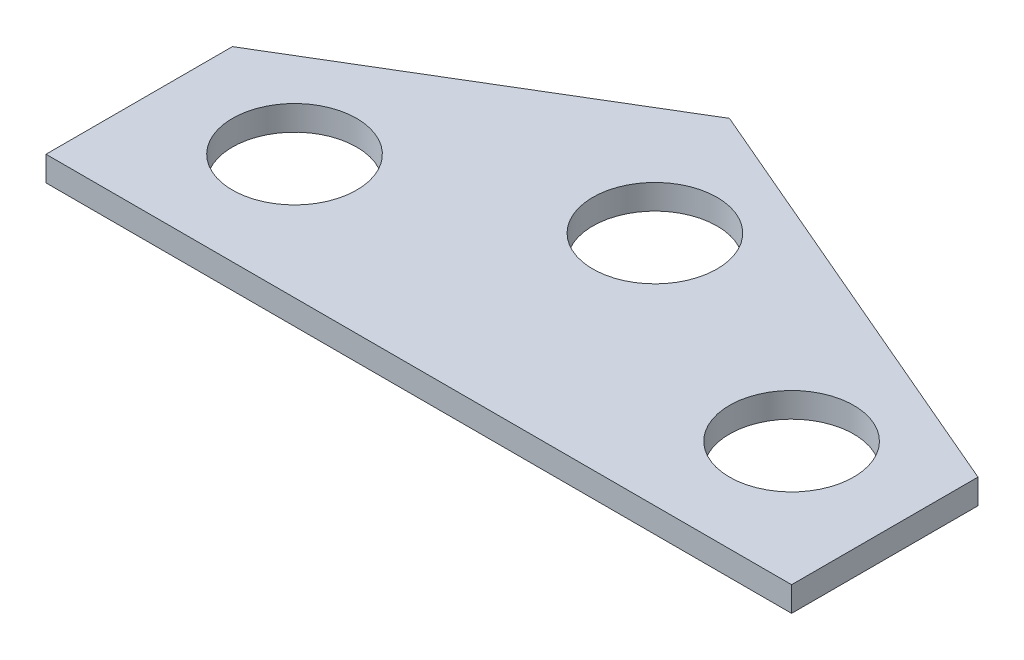
ISO-10303-21;
HEADER;
FILE_DESCRIPTION(('STEP AP214'),'2;1');
FILE_NAME('part.step','',(''),(''),'','','');
FILE_SCHEMA(('AUTOMOTIVE_DESIGN { 1 0 10303 214 1 1 1 1 }'));
ENDSEC;
DATA;
#1=APPLICATION_CONTEXT('core data for automotive mechanical design processes');
#2=APPLICATION_PROTOCOL_DEFINITION('international standard','automotive_design',2000,#1);
#3=PRODUCT_CONTEXT('',#1,'mechanical');
#4=PRODUCT('Part','Part','',(#3));
#5=PRODUCT_RELATED_PRODUCT_CATEGORY('part','',(#4));
#6=PRODUCT_DEFINITION_FORMATION('','',#4);
#7=PRODUCT_DEFINITION_CONTEXT('part definition',#1,'design');
#8=PRODUCT_DEFINITION('design','',#6,#7);
#9=PRODUCT_DEFINITION_SHAPE('','',#8);
#10=(LENGTH_UNIT() NAMED_UNIT(*) SI_UNIT(.MILLI.,.METRE.));
#11=(NAMED_UNIT(*) PLANE_ANGLE_UNIT() SI_UNIT($,.RADIAN.));
#12=(NAMED_UNIT(*) SI_UNIT($,.STERADIAN.) SOLID_ANGLE_UNIT());
#13=UNCERTAINTY_MEASURE_WITH_UNIT(LENGTH_MEASURE(1.E-05),#10,'distance_accuracy_value','');
#14=(GEOMETRIC_REPRESENTATION_CONTEXT(3) GLOBAL_UNCERTAINTY_ASSIGNED_CONTEXT((#13)) GLOBAL_UNIT_ASSIGNED_CONTEXT((#10,
#11,#12)) REPRESENTATION_CONTEXT('',''));
#15=CARTESIAN_POINT('',(0.,0.,0.));
#16=DIRECTION('',(0.,0.,1.));
#17=DIRECTION('',(1.,0.,0.));
#18=AXIS2_PLACEMENT_3D('',#15,#16,#17);
#19=CARTESIAN_POINT('',(0.,2.,0.));
#20=DIRECTION('',(1.,0.,0.));
#21=DIRECTION('',(0.,0.,-1.));
#22=AXIS2_PLACEMENT_3D('',#19,#20,#21);
#23=PLANE('',#22);
#24=DIRECTION('',(0.,0.,1.));
#25=VECTOR('',#24,1.);
#26=CARTESIAN_POINT('',(0.,2.,0.));
#27=LINE('',#26,#25);
#28=CARTESIAN_POINT('',(0.,2.,-15.));
#29=VERTEX_POINT('',#28);
#30=CARTESIAN_POINT('',(0.,2.,0.));
#31=VERTEX_POINT('',#30);
#32=EDGE_CURVE('E115',#29,#31,#27,.T.);
#33=ORIENTED_EDGE('',*,*,#32,.F.);
#34=DIRECTION('',(0.,1.,0.));
#35=VECTOR('',#34,1.);
#36=CARTESIAN_POINT('',(0.,0.,-15.));
#37=LINE('',#36,#35);
#38=CARTESIAN_POINT('',(0.,0.,-15.));
#39=VERTEX_POINT('',#38);
#40=EDGE_CURVE('E127',#39,#29,#37,.T.);
#41=ORIENTED_EDGE('',*,*,#40,.F.);
#42=DIRECTION('',(0.,0.,1.));
#43=VECTOR('',#42,1.);
#44=CARTESIAN_POINT('',(0.,0.,0.));
#45=LINE('',#44,#43);
#46=CARTESIAN_POINT('',(0.,0.,0.));
#47=VERTEX_POINT('',#46);
#48=EDGE_CURVE('E103',#39,#47,#45,.T.);
#49=ORIENTED_EDGE('',*,*,#48,.T.);
#50=DIRECTION('',(0.,-1.,0.));
#51=VECTOR('',#50,1.);
#52=CARTESIAN_POINT('',(0.,2.,0.));
#53=LINE('',#52,#51);
#54=EDGE_CURVE('E12',#31,#47,#53,.T.);
#55=ORIENTED_EDGE('',*,*,#54,.F.);
#56=EDGE_LOOP('',(#33,#41,#49,#55));
#57=FACE_BOUND('',#56,.T.);
#58=ADVANCED_FACE('F57',(#57),#23,.F.);
#59=CARTESIAN_POINT('',(0.,2.,0.));
#60=DIRECTION('',(0.,0.,-1.));
#61=DIRECTION('',(-1.,0.,0.));
#62=AXIS2_PLACEMENT_3D('',#59,#60,#61);
#63=PLANE('',#62);
#64=DIRECTION('',(1.,0.,0.));
#65=VECTOR('',#64,1.);
#66=CARTESIAN_POINT('',(0.,0.,0.));
#67=LINE('',#66,#65);
#68=CARTESIAN_POINT('',(60.,0.,0.));
#69=VERTEX_POINT('',#68);
#70=EDGE_CURVE('E93',#47,#69,#67,.T.);
#71=ORIENTED_EDGE('',*,*,#70,.T.);
#72=DIRECTION('',(0.,-1.,0.));
#73=VECTOR('',#72,1.);
#74=CARTESIAN_POINT('',(60.,2.,0.));
#75=LINE('',#74,#73);
#76=CARTESIAN_POINT('',(60.,2.,0.));
#77=VERTEX_POINT('',#76);
#78=EDGE_CURVE('E65',#77,#69,#75,.T.);
#79=ORIENTED_EDGE('',*,*,#78,.F.);
#80=DIRECTION('',(1.,0.,0.));
#81=VECTOR('',#80,1.);
#82=CARTESIAN_POINT('',(0.,2.,0.));
#83=LINE('',#82,#81);
#84=EDGE_CURVE('E81',#31,#77,#83,.T.);
#85=ORIENTED_EDGE('',*,*,#84,.F.);
#86=ORIENTED_EDGE('',*,*,#54,.T.);
#87=EDGE_LOOP('',(#71,#79,#85,#86));
#88=FACE_BOUND('',#87,.T.);
#89=ADVANCED_FACE('F95',(#88),#63,.F.);
#90=CARTESIAN_POINT('',(60.,2.,0.));
#91=DIRECTION('',(-1.,0.,0.));
#92=DIRECTION('',(0.,0.,1.));
#93=AXIS2_PLACEMENT_3D('',#90,#91,#92);
#94=PLANE('',#93);
#95=DIRECTION('',(0.,0.,-1.));
#96=VECTOR('',#95,1.);
#97=CARTESIAN_POINT('',(60.,0.,0.));
#98=LINE('',#97,#96);
#99=CARTESIAN_POINT('',(60.,0.,-15.));
#100=VERTEX_POINT('',#99);
#101=EDGE_CURVE('E102',#69,#100,#98,.T.);
#102=ORIENTED_EDGE('',*,*,#101,.T.);
#103=DIRECTION('',(0.,1.,0.));
#104=VECTOR('',#103,1.);
#105=CARTESIAN_POINT('',(60.,0.,-15.));
#106=LINE('',#105,#104);
#107=CARTESIAN_POINT('',(60.,2.,-15.));
#108=VERTEX_POINT('',#107);
#109=EDGE_CURVE('E138',#100,#108,#106,.T.);
#110=ORIENTED_EDGE('',*,*,#109,.T.);
#111=DIRECTION('',(0.,0.,-1.));
#112=VECTOR('',#111,1.);
#113=CARTESIAN_POINT('',(60.,2.,0.));
#114=LINE('',#113,#112);
#115=EDGE_CURVE('E110',#77,#108,#114,.T.);
#116=ORIENTED_EDGE('',*,*,#115,.F.);
#117=ORIENTED_EDGE('',*,*,#78,.T.);
#118=EDGE_LOOP('',(#102,#110,#116,#117));
#119=FACE_BOUND('',#118,.T.);
#120=ADVANCED_FACE('F107',(#119),#94,.F.);
#121=CARTESIAN_POINT('',(0.,2.,0.));
#122=DIRECTION('',(0.,-1.,0.));
#123=DIRECTION('',(0.,0.,-1.));
#124=AXIS2_PLACEMENT_3D('',#121,#122,#123);
#125=PLANE('',#124);
#126=CARTESIAN_POINT('',(10.,2.,-10.));
#127=DIRECTION('',(0.,-1.,0.));
#128=DIRECTION('',(0.,0.,-1.));
#129=AXIS2_PLACEMENT_3D('',#126,#127,#128);
#130=CIRCLE('',#129,5.);
#131=CARTESIAN_POINT('',(10.,2.,-15.));
#132=VERTEX_POINT('',#131);
#133=EDGE_CURVE('E147',#132,#132,#130,.T.);
#134=ORIENTED_EDGE('',*,*,#133,.T.);
#135=EDGE_LOOP('',(#134));
#136=FACE_BOUND('',#135,.T.);
#137=CARTESIAN_POINT('',(50.,2.,-10.));
#138=DIRECTION('',(0.,-1.,0.));
#139=DIRECTION('',(0.,0.,1.));
#140=AXIS2_PLACEMENT_3D('',#137,#138,#139);
#141=CIRCLE('',#140,5.);
#142=CARTESIAN_POINT('',(50.,2.,-5.));
#143=VERTEX_POINT('',#142);
#144=EDGE_CURVE('E162',#143,#143,#141,.T.);
#145=ORIENTED_EDGE('',*,*,#144,.T.);
#146=EDGE_LOOP('',(#145));
#147=FACE_BOUND('',#146,.T.);
#148=CARTESIAN_POINT('',(30.,2.,-19.));
#149=DIRECTION('',(0.,-1.,0.));
#150=DIRECTION('',(0.,0.,-1.));
#151=AXIS2_PLACEMENT_3D('',#148,#149,#150);
#152=CIRCLE('',#151,5.);
#153=CARTESIAN_POINT('',(30.,2.,-24.));
#154=VERTEX_POINT('',#153);
#155=EDGE_CURVE('E154',#154,#154,#152,.T.);
#156=ORIENTED_EDGE('',*,*,#155,.T.);
#157=EDGE_LOOP('',(#156));
#158=FACE_BOUND('',#157,.T.);
#159=ORIENTED_EDGE('',*,*,#115,.T.);
#160=DIRECTION('',(0.919145030018058,0.,0.393919298579168));
#161=VECTOR('',#160,1.);
#162=CARTESIAN_POINT('',(14.7413793103448,2.,-34.3965517241379));
#163=LINE('',#162,#161);
#164=CARTESIAN_POINT('',(25.,2.,-30.));
#165=VERTEX_POINT('',#164);
#166=EDGE_CURVE('E143',#165,#108,#163,.T.);
#167=ORIENTED_EDGE('',*,*,#166,.F.);
#168=DIRECTION('',(0.857492925712544,0.,-0.514495755427526));
#169=VECTOR('',#168,1.);
#170=CARTESIAN_POINT('',(-6.61764705882353,2.,-11.0294117647059));
#171=LINE('',#170,#169);
#172=EDGE_CURVE('E134',#29,#165,#171,.T.);
#173=ORIENTED_EDGE('',*,*,#172,.F.);
#174=ORIENTED_EDGE('',*,*,#32,.T.);
#175=ORIENTED_EDGE('',*,*,#84,.T.);
#176=EDGE_LOOP('',(#159,#167,#173,#174,#175));
#177=FACE_BOUND('',#176,.T.);
#178=ADVANCED_FACE('F174',(#136,#147,#158,#177),#125,.F.);
#179=CARTESIAN_POINT('',(0.,0.,0.));
#180=DIRECTION('',(0.,-1.,0.));
#181=DIRECTION('',(0.,0.,-1.));
#182=AXIS2_PLACEMENT_3D('',#179,#180,#181);
#183=PLANE('',#182);
#184=CARTESIAN_POINT('',(10.,0.,-10.));
#185=DIRECTION('',(0.,-1.,0.));
#186=DIRECTION('',(0.,0.,-1.));
#187=AXIS2_PLACEMENT_3D('',#184,#185,#186);
#188=CIRCLE('',#187,5.);
#189=CARTESIAN_POINT('',(10.,0.,-15.));
#190=VERTEX_POINT('',#189);
#191=EDGE_CURVE('E166',#190,#190,#188,.T.);
#192=ORIENTED_EDGE('',*,*,#191,.F.);
#193=EDGE_LOOP('',(#192));
#194=FACE_BOUND('',#193,.T.);
#195=CARTESIAN_POINT('',(50.,0.,-10.));
#196=DIRECTION('',(0.,-1.,0.));
#197=DIRECTION('',(0.,0.,1.));
#198=AXIS2_PLACEMENT_3D('',#195,#196,#197);
#199=CIRCLE('',#198,5.);
#200=CARTESIAN_POINT('',(50.,0.,-5.));
#201=VERTEX_POINT('',#200);
#202=EDGE_CURVE('E158',#201,#201,#199,.T.);
#203=ORIENTED_EDGE('',*,*,#202,.F.);
#204=EDGE_LOOP('',(#203));
#205=FACE_BOUND('',#204,.T.);
#206=CARTESIAN_POINT('',(30.,0.,-19.));
#207=DIRECTION('',(0.,-1.,0.));
#208=DIRECTION('',(0.,0.,-1.));
#209=AXIS2_PLACEMENT_3D('',#206,#207,#208);
#210=CIRCLE('',#209,5.);
#211=CARTESIAN_POINT('',(30.,0.,-24.));
#212=VERTEX_POINT('',#211);
#213=EDGE_CURVE('E150',#212,#212,#210,.T.);
#214=ORIENTED_EDGE('',*,*,#213,.F.);
#215=EDGE_LOOP('',(#214));
#216=FACE_BOUND('',#215,.T.);
#217=DIRECTION('',(0.919145030018058,0.,0.393919298579168));
#218=VECTOR('',#217,1.);
#219=CARTESIAN_POINT('',(14.7413793103448,0.,-34.3965517241379));
#220=LINE('',#219,#218);
#221=CARTESIAN_POINT('',(25.,0.,-30.));
#222=VERTEX_POINT('',#221);
#223=EDGE_CURVE('E72',#222,#100,#220,.T.);
#224=ORIENTED_EDGE('',*,*,#223,.T.);
#225=ORIENTED_EDGE('',*,*,#101,.F.);
#226=ORIENTED_EDGE('',*,*,#70,.F.);
#227=ORIENTED_EDGE('',*,*,#48,.F.);
#228=DIRECTION('',(0.857492925712544,0.,-0.514495755427526));
#229=VECTOR('',#228,1.);
#230=CARTESIAN_POINT('',(-6.61764705882353,0.,-11.0294117647059));
#231=LINE('',#230,#229);
#232=EDGE_CURVE('E131',#39,#222,#231,.T.);
#233=ORIENTED_EDGE('',*,*,#232,.T.);
#234=EDGE_LOOP('',(#224,#225,#226,#227,#233));
#235=FACE_BOUND('',#234,.T.);
#236=ADVANCED_FACE('F112',(#194,#205,#216,#235),#183,.T.);
#237=CARTESIAN_POINT('',(-6.61764705882353,0.,-11.0294117647059));
#238=DIRECTION('',(0.514495755427526,0.,0.857492925712544));
#239=DIRECTION('',(0.857492925712544,0.,-0.514495755427526));
#240=AXIS2_PLACEMENT_3D('',#237,#238,#239);
#241=PLANE('',#240);
#242=ORIENTED_EDGE('',*,*,#172,.T.);
#243=DIRECTION('',(0.,1.,0.));
#244=VECTOR('',#243,1.);
#245=CARTESIAN_POINT('',(25.,0.,-30.));
#246=LINE('',#245,#244);
#247=EDGE_CURVE('E122',#222,#165,#246,.T.);
#248=ORIENTED_EDGE('',*,*,#247,.F.);
#249=ORIENTED_EDGE('',*,*,#232,.F.);
#250=ORIENTED_EDGE('',*,*,#40,.T.);
#251=EDGE_LOOP('',(#242,#248,#249,#250));
#252=FACE_BOUND('',#251,.T.);
#253=ADVANCED_FACE('F186',(#252),#241,.F.);
#254=CARTESIAN_POINT('',(14.7413793103448,0.,-34.3965517241379));
#255=DIRECTION('',(-0.393919298579168,0.,0.919145030018058));
#256=DIRECTION('',(0.919145030018058,0.,0.393919298579168));
#257=AXIS2_PLACEMENT_3D('',#254,#255,#256);
#258=PLANE('',#257);
#259=ORIENTED_EDGE('',*,*,#166,.T.);
#260=ORIENTED_EDGE('',*,*,#109,.F.);
#261=ORIENTED_EDGE('',*,*,#223,.F.);
#262=ORIENTED_EDGE('',*,*,#247,.T.);
#263=EDGE_LOOP('',(#259,#260,#261,#262));
#264=FACE_BOUND('',#263,.T.);
#265=ADVANCED_FACE('F194',(#264),#258,.F.);
#266=CARTESIAN_POINT('',(30.,2.,-19.));
#267=DIRECTION('',(0.,-1.,0.));
#268=DIRECTION('',(0.,0.,-1.));
#269=AXIS2_PLACEMENT_3D('',#266,#267,#268);
#270=CYLINDRICAL_SURFACE('',#269,5.);
#271=ORIENTED_EDGE('',*,*,#155,.F.);
#272=EDGE_LOOP('',(#271));
#273=FACE_BOUND('',#272,.T.);
#274=ORIENTED_EDGE('',*,*,#213,.T.);
#275=EDGE_LOOP('',(#274));
#276=FACE_BOUND('',#275,.T.);
#277=ADVANCED_FACE('F192',(#273,#276),#270,.F.);
#278=CARTESIAN_POINT('',(50.,2.,-10.));
#279=DIRECTION('',(0.,-1.,0.));
#280=DIRECTION('',(0.,0.,-1.));
#281=AXIS2_PLACEMENT_3D('',#278,#279,#280);
#282=CYLINDRICAL_SURFACE('',#281,5.);
#283=ORIENTED_EDGE('',*,*,#144,.F.);
#284=EDGE_LOOP('',(#283));
#285=FACE_BOUND('',#284,.T.);
#286=ORIENTED_EDGE('',*,*,#202,.T.);
#287=EDGE_LOOP('',(#286));
#288=FACE_BOUND('',#287,.T.);
#289=ADVANCED_FACE('F180',(#285,#288),#282,.F.);
#290=CARTESIAN_POINT('',(10.,2.,-10.));
#291=DIRECTION('',(0.,-1.,0.));
#292=DIRECTION('',(0.,0.,-1.));
#293=AXIS2_PLACEMENT_3D('',#290,#291,#292);
#294=CYLINDRICAL_SURFACE('',#293,5.);
#295=ORIENTED_EDGE('',*,*,#133,.F.);
#296=EDGE_LOOP('',(#295));
#297=FACE_BOUND('',#296,.T.);
#298=ORIENTED_EDGE('',*,*,#191,.T.);
#299=EDGE_LOOP('',(#298));
#300=FACE_BOUND('',#299,.T.);
#301=ADVANCED_FACE('F177',(#297,#300),#294,.F.);
#302=CLOSED_SHELL('',(#58,#89,#120,#178,#236,#253,#265,#277,#289,#301));
#303=MANIFOLD_SOLID_BREP('B2',#302);
#304=ADVANCED_BREP_SHAPE_REPRESENTATION('',(#18,#303),#14);
#305=SHAPE_DEFINITION_REPRESENTATION(#9,#304);
ENDSEC;
END-ISO-10303-21;
